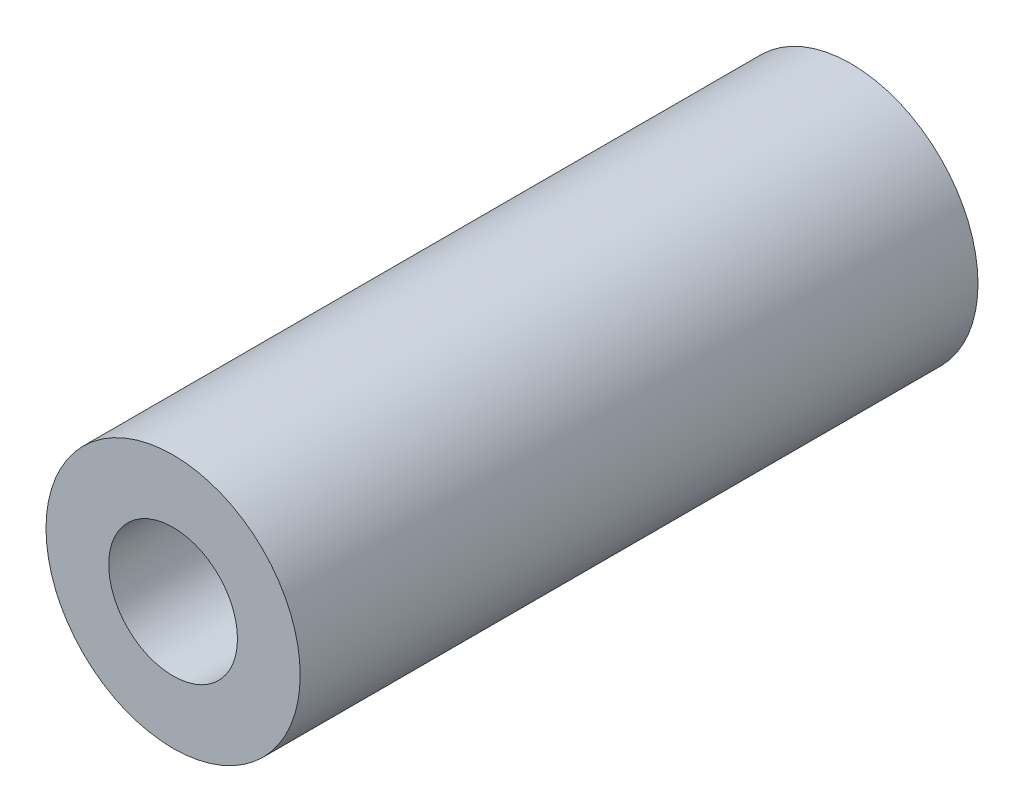
ISO-10303-21;
HEADER;
FILE_DESCRIPTION(('STEP AP214'),'2;1');
FILE_NAME('part.step','',(''),(''),'','','');
FILE_SCHEMA(('AUTOMOTIVE_DESIGN { 1 0 10303 214 1 1 1 1 }'));
ENDSEC;
DATA;
#1=APPLICATION_CONTEXT('core data for automotive mechanical design processes');
#2=APPLICATION_PROTOCOL_DEFINITION('international standard','automotive_design',2000,#1);
#3=PRODUCT_CONTEXT('',#1,'mechanical');
#4=PRODUCT('Part','Part','',(#3));
#5=PRODUCT_RELATED_PRODUCT_CATEGORY('part','',(#4));
#6=PRODUCT_DEFINITION_FORMATION('','',#4);
#7=PRODUCT_DEFINITION_CONTEXT('part definition',#1,'design');
#8=PRODUCT_DEFINITION('design','',#6,#7);
#9=PRODUCT_DEFINITION_SHAPE('','',#8);
#10=(LENGTH_UNIT() NAMED_UNIT(*) SI_UNIT(.MILLI.,.METRE.));
#11=(NAMED_UNIT(*) PLANE_ANGLE_UNIT() SI_UNIT($,.RADIAN.));
#12=(NAMED_UNIT(*) SI_UNIT($,.STERADIAN.) SOLID_ANGLE_UNIT());
#13=UNCERTAINTY_MEASURE_WITH_UNIT(LENGTH_MEASURE(1.E-05),#10,'distance_accuracy_value','');
#14=(GEOMETRIC_REPRESENTATION_CONTEXT(3) GLOBAL_UNCERTAINTY_ASSIGNED_CONTEXT((#13)) GLOBAL_UNIT_ASSIGNED_CONTEXT((#10,
#11,#12)) REPRESENTATION_CONTEXT('',''));
#15=CARTESIAN_POINT('',(0.,0.,0.));
#16=DIRECTION('',(0.,0.,1.));
#17=DIRECTION('',(1.,0.,0.));
#18=AXIS2_PLACEMENT_3D('',#15,#16,#17);
#19=CARTESIAN_POINT('',(0.,0.,50.8));
#20=DIRECTION('',(0.,0.,1.));
#21=DIRECTION('',(1.,0.,0.));
#22=AXIS2_PLACEMENT_3D('',#19,#20,#21);
#23=PLANE('',#22);
#24=CARTESIAN_POINT('',(0.,0.,50.8));
#25=DIRECTION('',(0.,0.,1.));
#26=DIRECTION('',(1.,0.,0.));
#27=AXIS2_PLACEMENT_3D('',#24,#25,#26);
#28=CIRCLE('',#27,9.525);
#29=CARTESIAN_POINT('',(9.525,0.,50.8));
#30=VERTEX_POINT('',#29);
#31=EDGE_CURVE('E10',#30,#30,#28,.T.);
#32=ORIENTED_EDGE('',*,*,#31,.T.);
#33=EDGE_LOOP('',(#32));
#34=FACE_BOUND('',#33,.T.);
#35=CARTESIAN_POINT('',(0.,0.,50.8));
#36=DIRECTION('',(0.,0.,1.));
#37=DIRECTION('',(1.,0.,0.));
#38=AXIS2_PLACEMENT_3D('',#35,#36,#37);
#39=CIRCLE('',#38,4.826);
#40=CARTESIAN_POINT('',(4.826,0.,50.8));
#41=VERTEX_POINT('',#40);
#42=EDGE_CURVE('E56',#41,#41,#39,.T.);
#43=ORIENTED_EDGE('',*,*,#42,.F.);
#44=EDGE_LOOP('',(#43));
#45=FACE_BOUND('',#44,.T.);
#46=ADVANCED_FACE('F43',(#34,#45),#23,.T.);
#47=CARTESIAN_POINT('',(0.,0.,0.));
#48=DIRECTION('',(0.,0.,1.));
#49=DIRECTION('',(1.,0.,0.));
#50=AXIS2_PLACEMENT_3D('',#47,#48,#49);
#51=PLANE('',#50);
#52=CARTESIAN_POINT('',(0.,0.,0.));
#53=DIRECTION('',(0.,0.,1.));
#54=DIRECTION('',(1.,0.,0.));
#55=AXIS2_PLACEMENT_3D('',#52,#53,#54);
#56=CIRCLE('',#55,9.525);
#57=CARTESIAN_POINT('',(9.525,0.,0.));
#58=VERTEX_POINT('',#57);
#59=EDGE_CURVE('E47',#58,#58,#56,.T.);
#60=ORIENTED_EDGE('',*,*,#59,.F.);
#61=EDGE_LOOP('',(#60));
#62=FACE_BOUND('',#61,.T.);
#63=CARTESIAN_POINT('',(0.,0.,0.));
#64=DIRECTION('',(0.,0.,1.));
#65=DIRECTION('',(1.,0.,0.));
#66=AXIS2_PLACEMENT_3D('',#63,#64,#65);
#67=CIRCLE('',#66,4.826);
#68=CARTESIAN_POINT('',(4.826,0.,0.));
#69=VERTEX_POINT('',#68);
#70=EDGE_CURVE('E58',#69,#69,#67,.T.);
#71=ORIENTED_EDGE('',*,*,#70,.T.);
#72=EDGE_LOOP('',(#71));
#73=FACE_BOUND('',#72,.T.);
#74=ADVANCED_FACE('F70',(#62,#73),#51,.F.);
#75=CARTESIAN_POINT('',(0.,0.,50.8));
#76=DIRECTION('',(0.,0.,-1.));
#77=DIRECTION('',(-1.,0.,0.));
#78=AXIS2_PLACEMENT_3D('',#75,#76,#77);
#79=CYLINDRICAL_SURFACE('',#78,9.525);
#80=ORIENTED_EDGE('',*,*,#31,.F.);
#81=EDGE_LOOP('',(#80));
#82=FACE_BOUND('',#81,.T.);
#83=ORIENTED_EDGE('',*,*,#59,.T.);
#84=EDGE_LOOP('',(#83));
#85=FACE_BOUND('',#84,.T.);
#86=ADVANCED_FACE('F45',(#82,#85),#79,.T.);
#87=CARTESIAN_POINT('',(0.,0.,50.8));
#88=DIRECTION('',(0.,0.,-1.));
#89=DIRECTION('',(-1.,0.,0.));
#90=AXIS2_PLACEMENT_3D('',#87,#88,#89);
#91=CYLINDRICAL_SURFACE('',#90,4.826);
#92=ORIENTED_EDGE('',*,*,#42,.T.);
#93=EDGE_LOOP('',(#92));
#94=FACE_BOUND('',#93,.T.);
#95=ORIENTED_EDGE('',*,*,#70,.F.);
#96=EDGE_LOOP('',(#95));
#97=FACE_BOUND('',#96,.T.);
#98=ADVANCED_FACE('F66',(#94,#97),#91,.F.);
#99=CLOSED_SHELL('',(#46,#74,#86,#98));
#100=MANIFOLD_SOLID_BREP('B2',#99);
#101=ADVANCED_BREP_SHAPE_REPRESENTATION('',(#18,#100),#14);
#102=SHAPE_DEFINITION_REPRESENTATION(#9,#101);
ENDSEC;
END-ISO-10303-21;
